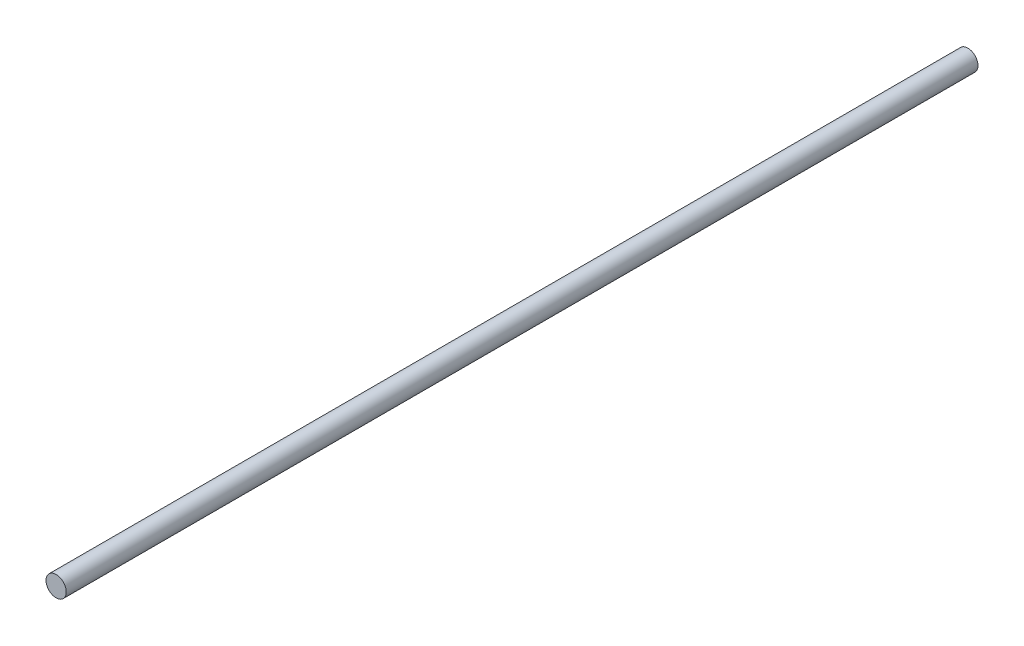
ISO-10303-21;
HEADER;
FILE_DESCRIPTION(('STEP AP214'),'2;1');
FILE_NAME('part.step','',(''),(''),'','','');
FILE_SCHEMA(('AUTOMOTIVE_DESIGN { 1 0 10303 214 1 1 1 1 }'));
ENDSEC;
DATA;
#1=APPLICATION_CONTEXT('core data for automotive mechanical design processes');
#2=APPLICATION_PROTOCOL_DEFINITION('international standard','automotive_design',2000,#1);
#3=PRODUCT_CONTEXT('',#1,'mechanical');
#4=PRODUCT('Part','Part','',(#3));
#5=PRODUCT_RELATED_PRODUCT_CATEGORY('part','',(#4));
#6=PRODUCT_DEFINITION_FORMATION('','',#4);
#7=PRODUCT_DEFINITION_CONTEXT('part definition',#1,'design');
#8=PRODUCT_DEFINITION('design','',#6,#7);
#9=PRODUCT_DEFINITION_SHAPE('','',#8);
#10=(LENGTH_UNIT() NAMED_UNIT(*) SI_UNIT(.MILLI.,.METRE.));
#11=(NAMED_UNIT(*) PLANE_ANGLE_UNIT() SI_UNIT($,.RADIAN.));
#12=(NAMED_UNIT(*) SI_UNIT($,.STERADIAN.) SOLID_ANGLE_UNIT());
#13=UNCERTAINTY_MEASURE_WITH_UNIT(LENGTH_MEASURE(1.E-05),#10,'distance_accuracy_value','');
#14=(GEOMETRIC_REPRESENTATION_CONTEXT(3) GLOBAL_UNCERTAINTY_ASSIGNED_CONTEXT((#13)) GLOBAL_UNIT_ASSIGNED_CONTEXT((#10,
#11,#12)) REPRESENTATION_CONTEXT('',''));
#15=CARTESIAN_POINT('',(0.,0.,0.));
#16=DIRECTION('',(0.,0.,1.));
#17=DIRECTION('',(1.,0.,0.));
#18=AXIS2_PLACEMENT_3D('',#15,#16,#17);
#19=CARTESIAN_POINT('',(0.,0.,270.));
#20=DIRECTION('',(0.,0.,-1.));
#21=DIRECTION('',(-1.,0.,0.));
#22=AXIS2_PLACEMENT_3D('',#19,#20,#21);
#23=CYLINDRICAL_SURFACE('',#22,3.);
#24=CARTESIAN_POINT('',(0.,0.,270.));
#25=DIRECTION('',(0.,0.,1.));
#26=DIRECTION('',(1.,0.,0.));
#27=AXIS2_PLACEMENT_3D('',#24,#25,#26);
#28=CIRCLE('',#27,3.);
#29=CARTESIAN_POINT('',(3.,0.,270.));
#30=VERTEX_POINT('',#29);
#31=EDGE_CURVE('E10',#30,#30,#28,.T.);
#32=ORIENTED_EDGE('',*,*,#31,.F.);
#33=EDGE_LOOP('',(#32));
#34=FACE_BOUND('',#33,.T.);
#35=CARTESIAN_POINT('',(0.,0.,0.));
#36=DIRECTION('',(0.,0.,1.));
#37=DIRECTION('',(1.,0.,0.));
#38=AXIS2_PLACEMENT_3D('',#35,#36,#37);
#39=CIRCLE('',#38,3.);
#40=CARTESIAN_POINT('',(3.,0.,0.));
#41=VERTEX_POINT('',#40);
#42=EDGE_CURVE('E39',#41,#41,#39,.T.);
#43=ORIENTED_EDGE('',*,*,#42,.T.);
#44=EDGE_LOOP('',(#43));
#45=FACE_BOUND('',#44,.T.);
#46=ADVANCED_FACE('F36',(#34,#45),#23,.T.);
#47=CARTESIAN_POINT('',(0.,0.,270.));
#48=DIRECTION('',(0.,0.,1.));
#49=DIRECTION('',(1.,0.,0.));
#50=AXIS2_PLACEMENT_3D('',#47,#48,#49);
#51=PLANE('',#50);
#52=ORIENTED_EDGE('',*,*,#31,.T.);
#53=EDGE_LOOP('',(#52));
#54=FACE_BOUND('',#53,.T.);
#55=ADVANCED_FACE('F51',(#54),#51,.T.);
#56=CARTESIAN_POINT('',(0.,0.,0.));
#57=DIRECTION('',(0.,0.,1.));
#58=DIRECTION('',(1.,0.,0.));
#59=AXIS2_PLACEMENT_3D('',#56,#57,#58);
#60=PLANE('',#59);
#61=ORIENTED_EDGE('',*,*,#42,.F.);
#62=EDGE_LOOP('',(#61));
#63=FACE_BOUND('',#62,.T.);
#64=ADVANCED_FACE('F49',(#63),#60,.F.);
#65=CLOSED_SHELL('',(#46,#55,#64));
#66=MANIFOLD_SOLID_BREP('B2',#65);
#67=ADVANCED_BREP_SHAPE_REPRESENTATION('',(#18,#66),#14);
#68=SHAPE_DEFINITION_REPRESENTATION(#9,#67);
ENDSEC;
END-ISO-10303-21;
